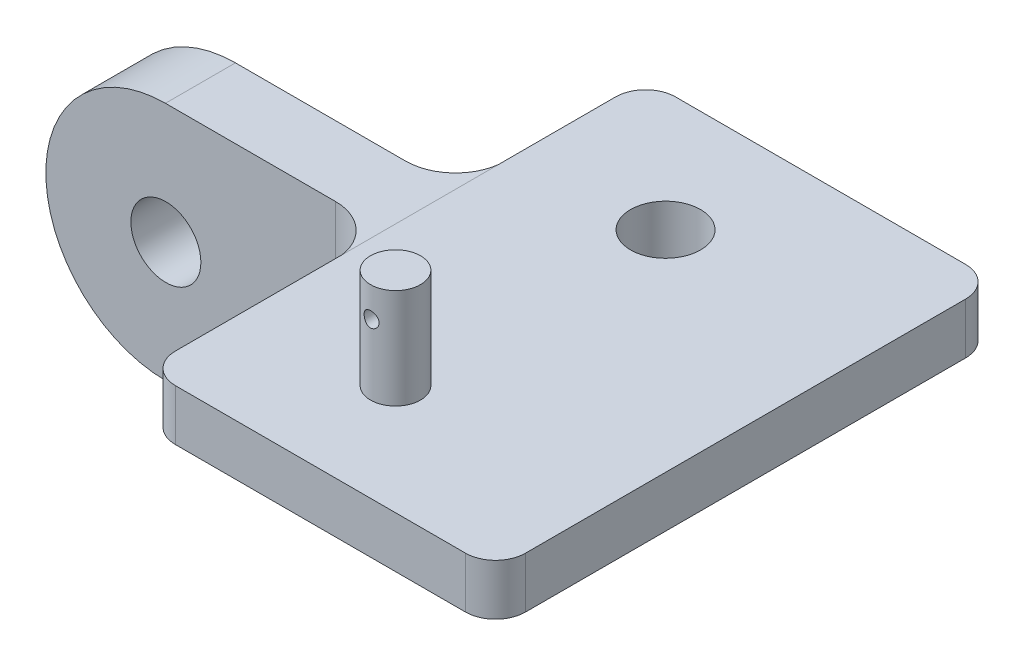
ISO-10303-21;
HEADER;
FILE_DESCRIPTION(('STEP AP214'),'2;1');
FILE_NAME('part.step','',(''),(''),'','','');
FILE_SCHEMA(('AUTOMOTIVE_DESIGN { 1 0 10303 214 1 1 1 1 }'));
ENDSEC;
DATA;
#1=APPLICATION_CONTEXT('core data for automotive mechanical design processes');
#2=APPLICATION_PROTOCOL_DEFINITION('international standard','automotive_design',2000,#1);
#3=PRODUCT_CONTEXT('',#1,'mechanical');
#4=PRODUCT('Part','Part','',(#3));
#5=PRODUCT_RELATED_PRODUCT_CATEGORY('part','',(#4));
#6=PRODUCT_DEFINITION_FORMATION('','',#4);
#7=PRODUCT_DEFINITION_CONTEXT('part definition',#1,'design');
#8=PRODUCT_DEFINITION('design','',#6,#7);
#9=PRODUCT_DEFINITION_SHAPE('','',#8);
#10=(LENGTH_UNIT() NAMED_UNIT(*) SI_UNIT(.MILLI.,.METRE.));
#11=(NAMED_UNIT(*) PLANE_ANGLE_UNIT() SI_UNIT($,.RADIAN.));
#12=(NAMED_UNIT(*) SI_UNIT($,.STERADIAN.) SOLID_ANGLE_UNIT());
#13=UNCERTAINTY_MEASURE_WITH_UNIT(LENGTH_MEASURE(1.E-05),#10,'distance_accuracy_value','');
#14=(GEOMETRIC_REPRESENTATION_CONTEXT(3) GLOBAL_UNCERTAINTY_ASSIGNED_CONTEXT((#13)) GLOBAL_UNIT_ASSIGNED_CONTEXT((#10,
#11,#12)) REPRESENTATION_CONTEXT('',''));
#15=CARTESIAN_POINT('',(0.,0.,0.));
#16=DIRECTION('',(0.,0.,1.));
#17=DIRECTION('',(1.,0.,0.));
#18=AXIS2_PLACEMENT_3D('',#15,#16,#17);
#19=CARTESIAN_POINT('',(-3.13547508911628,13.8103235534472,7.));
#20=DIRECTION('',(0.,0.,1.));
#21=DIRECTION('',(1.,0.,0.));
#22=AXIS2_PLACEMENT_3D('',#19,#20,#21);
#23=PLANE('',#22);
#24=CARTESIAN_POINT('',(-3.13547508911628,13.8103235534472,7.));
#25=DIRECTION('',(0.,0.,1.));
#26=DIRECTION('',(1.,0.,0.));
#27=AXIS2_PLACEMENT_3D('',#24,#25,#26);
#28=CIRCLE('',#27,26.);
#29=CARTESIAN_POINT('',(-1.12751244819405E-06,-11.9999225328672,7.));
#30=VERTEX_POINT('',#29);
#31=CARTESIAN_POINT('',(16.9567446831032,-2.69127347910797,7.));
#32=VERTEX_POINT('',#31);
#33=EDGE_CURVE('E172',#30,#32,#28,.T.);
#34=ORIENTED_EDGE('',*,*,#33,.T.);
#35=DIRECTION('',(0.,1.,0.));
#36=VECTOR('',#35,1.);
#37=CARTESIAN_POINT('',(16.9567446831032,13.8103235534472,7.));
#38=LINE('',#37,#36);
#39=CARTESIAN_POINT('',(16.9567446831032,12.,7.));
#40=VERTEX_POINT('',#39);
#41=EDGE_CURVE('E154',#32,#40,#38,.T.);
#42=ORIENTED_EDGE('',*,*,#41,.T.);
#43=DIRECTION('',(-1.,0.,0.));
#44=VECTOR('',#43,1.);
#45=CARTESIAN_POINT('',(-0.0432553168967856,12.,7.));
#46=LINE('',#45,#44);
#47=CARTESIAN_POINT('',(-0.0432553168967856,12.,7.));
#48=VERTEX_POINT('',#47);
#49=EDGE_CURVE('E146',#40,#48,#46,.T.);
#50=ORIENTED_EDGE('',*,*,#49,.T.);
#51=CARTESIAN_POINT('',(-0.000137029389256534,7.74663632754913E-05,7.));
#52=DIRECTION('',(0.,0.,1.));
#53=DIRECTION('',(1.,0.,0.));
#54=AXIS2_PLACEMENT_3D('',#51,#52,#53);
#55=CIRCLE('',#54,12.);
#56=EDGE_CURVE('E151',#48,#30,#55,.T.);
#57=ORIENTED_EDGE('',*,*,#56,.T.);
#58=EDGE_LOOP('',(#34,#42,#50,#57));
#59=FACE_BOUND('',#58,.T.);
#60=CARTESIAN_POINT('',(-0.000137029389256534,7.74663632754913E-05,7.));
#61=DIRECTION('',(0.,0.,1.));
#62=DIRECTION('',(1.,0.,0.));
#63=AXIS2_PLACEMENT_3D('',#60,#61,#62);
#64=CIRCLE('',#63,3.5);
#65=CARTESIAN_POINT('',(3.49986297061074,7.74663632754913E-05,7.));
#66=VERTEX_POINT('',#65);
#67=EDGE_CURVE('E180',#66,#66,#64,.T.);
#68=ORIENTED_EDGE('',*,*,#67,.F.);
#69=EDGE_LOOP('',(#68));
#70=FACE_BOUND('',#69,.T.);
#71=ADVANCED_FACE('F36',(#59,#70),#23,.T.);
#72=CARTESIAN_POINT('',(-3.13547508911628,13.8103235534472,0.));
#73=DIRECTION('',(0.,0.,1.));
#74=DIRECTION('',(1.,0.,0.));
#75=AXIS2_PLACEMENT_3D('',#72,#73,#74);
#76=PLANE('',#75);
#77=DIRECTION('',(-1.,0.,0.));
#78=VECTOR('',#77,1.);
#79=CARTESIAN_POINT('',(-0.0432553168967856,12.,0.));
#80=LINE('',#79,#78);
#81=CARTESIAN_POINT('',(16.9567446831032,12.,0.));
#82=VERTEX_POINT('',#81);
#83=CARTESIAN_POINT('',(-0.0432553168967856,12.,0.));
#84=VERTEX_POINT('',#83);
#85=EDGE_CURVE('E163',#82,#84,#80,.T.);
#86=ORIENTED_EDGE('',*,*,#85,.F.);
#87=DIRECTION('',(0.,1.,0.));
#88=VECTOR('',#87,1.);
#89=CARTESIAN_POINT('',(16.9567446831032,6.99999999999999,0.));
#90=LINE('',#89,#88);
#91=CARTESIAN_POINT('',(16.9567446831032,-2.69127347910797,0.));
#92=VERTEX_POINT('',#91);
#93=EDGE_CURVE('E190',#82,#92,#90,.F.);
#94=ORIENTED_EDGE('',*,*,#93,.T.);
#95=CARTESIAN_POINT('',(-3.13547508911628,13.8103235534472,0.));
#96=DIRECTION('',(0.,0.,1.));
#97=DIRECTION('',(1.,0.,0.));
#98=AXIS2_PLACEMENT_3D('',#95,#96,#97);
#99=CIRCLE('',#98,26.);
#100=CARTESIAN_POINT('',(-1.12751244819405E-06,-11.9999225328672,0.));
#101=VERTEX_POINT('',#100);
#102=EDGE_CURVE('E157',#101,#92,#99,.T.);
#103=ORIENTED_EDGE('',*,*,#102,.F.);
#104=CARTESIAN_POINT('',(-0.000137029389256534,7.74663632754913E-05,0.));
#105=DIRECTION('',(0.,0.,1.));
#106=DIRECTION('',(1.,0.,0.));
#107=AXIS2_PLACEMENT_3D('',#104,#105,#106);
#108=CIRCLE('',#107,12.);
#109=EDGE_CURVE('E179',#84,#101,#108,.T.);
#110=ORIENTED_EDGE('',*,*,#109,.F.);
#111=EDGE_LOOP('',(#86,#94,#103,#110));
#112=FACE_BOUND('',#111,.T.);
#113=CARTESIAN_POINT('',(-0.000137029389256534,7.74663632754913E-05,0.));
#114=DIRECTION('',(0.,0.,1.));
#115=DIRECTION('',(1.,0.,0.));
#116=AXIS2_PLACEMENT_3D('',#113,#114,#115);
#117=CIRCLE('',#116,3.5);
#118=CARTESIAN_POINT('',(3.49986297061074,7.74663632754913E-05,0.));
#119=VERTEX_POINT('',#118);
#120=EDGE_CURVE('E357',#119,#119,#117,.T.);
#121=ORIENTED_EDGE('',*,*,#120,.T.);
#122=EDGE_LOOP('',(#121));
#123=FACE_BOUND('',#122,.T.);
#124=ADVANCED_FACE('F292',(#112,#123),#76,.F.);
#125=CARTESIAN_POINT('',(-0.0432553168967856,12.,7.));
#126=DIRECTION('',(0.,-1.,0.));
#127=DIRECTION('',(0.,0.,-1.));
#128=AXIS2_PLACEMENT_3D('',#125,#126,#127);
#129=PLANE('',#128);
#130=DIRECTION('',(0.,0.,-1.));
#131=VECTOR('',#130,1.);
#132=CARTESIAN_POINT('',(21.9567446831032,12.,7.));
#133=LINE('',#132,#131);
#134=CARTESIAN_POINT('',(21.9567446831032,12.,12.));
#135=VERTEX_POINT('',#134);
#136=CARTESIAN_POINT('',(21.9567446831032,12.,-5.));
#137=VERTEX_POINT('',#136);
#138=EDGE_CURVE('E166',#135,#137,#133,.T.);
#139=ORIENTED_EDGE('',*,*,#138,.T.);
#140=CARTESIAN_POINT('',(16.9567446831032,12.,-5.));
#141=DIRECTION('',(0.,-1.,0.));
#142=DIRECTION('',(0.,0.,-1.));
#143=AXIS2_PLACEMENT_3D('',#140,#141,#142);
#144=CIRCLE('',#143,5.);
#145=EDGE_CURVE('E192',#137,#82,#144,.T.);
#146=ORIENTED_EDGE('',*,*,#145,.T.);
#147=ORIENTED_EDGE('',*,*,#85,.T.);
#148=DIRECTION('',(0.,0.,-1.));
#149=VECTOR('',#148,1.);
#150=CARTESIAN_POINT('',(-0.0432553168967856,12.,7.));
#151=LINE('',#150,#149);
#152=EDGE_CURVE('E160',#48,#84,#151,.T.);
#153=ORIENTED_EDGE('',*,*,#152,.F.);
#154=ORIENTED_EDGE('',*,*,#49,.F.);
#155=CARTESIAN_POINT('',(16.9567446831032,12.,12.));
#156=DIRECTION('',(0.,-1.,0.));
#157=DIRECTION('',(0.,0.,-1.));
#158=AXIS2_PLACEMENT_3D('',#155,#156,#157);
#159=CIRCLE('',#158,5.);
#160=EDGE_CURVE('E232',#40,#135,#159,.T.);
#161=ORIENTED_EDGE('',*,*,#160,.T.);
#162=EDGE_LOOP('',(#139,#146,#147,#153,#154,#161));
#163=FACE_BOUND('',#162,.T.);
#164=ADVANCED_FACE('F161',(#163),#129,.F.);
#165=CARTESIAN_POINT('',(-0.000137029389256534,7.74663632754913E-05,7.));
#166=DIRECTION('',(0.,0.,-1.));
#167=DIRECTION('',(-1.,0.,0.));
#168=AXIS2_PLACEMENT_3D('',#165,#166,#167);
#169=CYLINDRICAL_SURFACE('',#168,12.);
#170=ORIENTED_EDGE('',*,*,#109,.T.);
#171=DIRECTION('',(0.,0.,-1.));
#172=VECTOR('',#171,1.);
#173=CARTESIAN_POINT('',(-1.12751244819405E-06,-11.9999225328672,7.));
#174=LINE('',#173,#172);
#175=EDGE_CURVE('E167',#30,#101,#174,.T.);
#176=ORIENTED_EDGE('',*,*,#175,.F.);
#177=ORIENTED_EDGE('',*,*,#56,.F.);
#178=ORIENTED_EDGE('',*,*,#152,.T.);
#179=EDGE_LOOP('',(#170,#176,#177,#178));
#180=FACE_BOUND('',#179,.T.);
#181=ADVANCED_FACE('F169',(#180),#169,.T.);
#182=CARTESIAN_POINT('',(-3.13547508911628,13.8103235534472,7.));
#183=DIRECTION('',(0.,0.,-1.));
#184=DIRECTION('',(-1.,0.,0.));
#185=AXIS2_PLACEMENT_3D('',#182,#183,#184);
#186=CYLINDRICAL_SURFACE('',#185,26.);
#187=ORIENTED_EDGE('',*,*,#102,.T.);
#188=CARTESIAN_POINT('',(16.9567446831032,-2.69127347910797,0.));
#189=CARTESIAN_POINT('',(17.070231099464,-2.5530994384239,-9.26989505541306E-06));
#190=CARTESIAN_POINT('',(17.1822707251696,-2.41376868599156,-0.00386335790764295));
#191=CARTESIAN_POINT('',(17.4032466272942,-2.13309982371133,-0.018743276288638));
#192=CARTESIAN_POINT('',(17.5121837152668,-1.99176225356995,-0.0297672128644955));
#193=CARTESIAN_POINT('',(17.7266646073226,-1.70749850083177,-0.0584507238668967));
#194=CARTESIAN_POINT('',(17.8322126611707,-1.56457463651689,-0.0761016048940113));
#195=CARTESIAN_POINT('',(18.0399453478979,-1.27718840935005,-0.117593425972296));
#196=CARTESIAN_POINT('',(18.1421297314987,-1.13272593351839,-0.141434823638278));
#197=CARTESIAN_POINT('',(18.4440397339031,-0.696562483241409,-0.221774757620746));
#198=CARTESIAN_POINT('',(18.6385665045677,-0.402822755666844,-0.287010620158538));
#199=CARTESIAN_POINT('',(19.013315052953,0.18851248198175,-0.438054133036577));
#200=CARTESIAN_POINT('',(19.1935316149241,0.486109352344615,-0.523869238652336));
#201=CARTESIAN_POINT('',(19.5512288599767,1.10404903438962,-0.720618176466617));
#202=CARTESIAN_POINT('',(19.7276910324922,1.42456303540939,-0.83286285302044));
#203=CARTESIAN_POINT('',(20.0640967127785,2.06676217933068,-1.07729115280325));
#204=CARTESIAN_POINT('',(20.2240368581029,2.38844754688423,-1.20947882127396));
#205=CARTESIAN_POINT('',(20.4513137732606,2.86981070832899,-1.42247251980998));
#206=CARTESIAN_POINT('',(20.5248909699477,3.0298902668681,-1.49583105647801));
#207=CARTESIAN_POINT('',(20.6679082258822,3.34946461568907,-1.64766484852491));
#208=CARTESIAN_POINT('',(20.737348620187,3.50895945234537,-1.72613968843145));
#209=CARTESIAN_POINT('',(20.8720280963283,3.82685843517659,-1.88846150692929));
#210=CARTESIAN_POINT('',(20.9372695201537,3.98526314455929,-1.97230543790661));
#211=CARTESIAN_POINT('',(21.0635290544233,4.30048617735711,-2.14590658770641));
#212=CARTESIAN_POINT('',(21.1245478931708,4.45730477033854,-2.23566278155448));
#213=CARTESIAN_POINT('',(21.2174878868822,4.70304725180356,-2.38272397252399));
#214=CARTESIAN_POINT('',(21.2508473473785,4.79276939958791,-2.43778868012347));
#215=CARTESIAN_POINT('',(21.3160758164162,4.97116671594358,-2.55041687915507));
#216=CARTESIAN_POINT('',(21.3479448878814,5.05984192859791,-2.60798026489529));
#217=CARTESIAN_POINT('',(21.4413528905842,5.32419565360777,-2.7850050545784));
#218=CARTESIAN_POINT('',(21.5006022395724,5.49796256636809,-2.90865984037733));
#219=CARTESIAN_POINT('',(21.584539599234,5.75247093173351,-3.10563388944553));
#220=CARTESIAN_POINT('',(21.611792920174,5.83660086591316,-3.17349604971766));
#221=CARTESIAN_POINT('',(21.6643801124058,6.00169592304559,-3.31364833583479));
#222=CARTESIAN_POINT('',(21.6897146579761,6.08266215287109,-3.38593688989556));
#223=CARTESIAN_POINT('',(21.7381858659548,6.24013416058078,-3.53575508028062));
#224=CARTESIAN_POINT('',(21.7613252489371,6.31664541306305,-3.61327801977087));
#225=CARTESIAN_POINT('',(21.8050075556827,6.46334049119167,-3.77470866779921));
#226=CARTESIAN_POINT('',(21.8255535191316,6.53353169621413,-3.85860871348025));
#227=CARTESIAN_POINT('',(21.8613334169811,6.65747352106164,-4.02460174826745));
#228=CARTESIAN_POINT('',(21.8769023449687,6.71218234418246,-4.10589312313181));
#229=CARTESIAN_POINT('',(21.9046295722402,6.81062676490551,-4.27492916479743));
#230=CARTESIAN_POINT('',(21.9168073492532,6.85442487038787,-4.36263316396412));
#231=CARTESIAN_POINT('',(21.9362302461275,6.92476816378259,-4.5394518766194));
#232=CARTESIAN_POINT('',(21.9437244131123,6.95218023411873,-4.62817667526831));
#233=CARTESIAN_POINT('',(21.9514299362848,6.98044115703928,-4.76491959780763));
#234=CARTESIAN_POINT('',(21.9534104638482,6.98772407873483,-4.81154257636176));
#235=CARTESIAN_POINT('',(21.956072837743,6.99752439723626,-4.90542857855493));
#236=CARTESIAN_POINT('',(21.9567516672798,7.00003072379892,-4.95269283394889));
#237=CARTESIAN_POINT('',(21.9567446831032,6.99999999999998,-5.00000000000001));
#238=B_SPLINE_CURVE_WITH_KNOTS('',3,(#188,#189,#190,#191,#192,#193,#194,#195,#196,#197,#198,
#199,#200,#201,#202,#203,#204,#205,#206,#207,#208,#209,#210,#211,#212,#213,#214,#215,#216,#217,
#218,#219,#220,#221,#222,#223,#224,#225,#226,#227,#228,#229,#230,#231,#232,#233,#234,#235,#236,
#237),.UNSPECIFIED.,.F.,.F.,(4,2,2,2,2,2,2,2,2,2,2,2,2,2,2,2,2,2,2,2,2,2,2,2,4),(0.,
0.536328347004376,1.07251508957235,1.60800089212395,2.14352629008362,3.21734907871913,
4.29156147210523,5.43878676512284,6.58624507526594,7.15867879259614,7.73106608287921,
8.30313130509501,8.87509761141322,9.20634881475193,9.53758602008221,10.2009369110301,
10.5352431417181,10.8694313431759,11.2031998044433,11.536573357518,11.8335734757139,
12.128830774077,12.406633146776,12.5480808917549,12.6898560594473),.UNSPECIFIED.);
#239=CARTESIAN_POINT('',(21.9567446831032,6.99999999999999,-5.));
#240=VERTEX_POINT('',#239);
#241=EDGE_CURVE('E194',#92,#240,#238,.T.);
#242=ORIENTED_EDGE('',*,*,#241,.T.);
#243=DIRECTION('',(0.,0.,-1.));
#244=VECTOR('',#243,1.);
#245=CARTESIAN_POINT('',(21.9567446831032,6.99999999999999,7.));
#246=LINE('',#245,#244);
#247=CARTESIAN_POINT('',(21.9567446831032,6.99999999999999,12.));
#248=VERTEX_POINT('',#247);
#249=EDGE_CURVE('E174',#248,#240,#246,.T.);
#250=ORIENTED_EDGE('',*,*,#249,.F.);
#251=CARTESIAN_POINT('',(21.9567446831032,6.99999999999999,12.));
#252=CARTESIAN_POINT('',(21.9567519061623,7.00003157662,11.9524518786257));
#253=CARTESIAN_POINT('',(21.9560659914514,6.99749910440314,11.904945764695));
#254=CARTESIAN_POINT('',(21.9533766072229,6.98759957907609,11.8105914660933));
#255=CARTESIAN_POINT('',(21.9513763755148,6.98024440674368,11.7637419528228));
#256=CARTESIAN_POINT('',(21.9436091984904,6.95175829780433,11.6265859841257));
#257=CARTESIAN_POINT('',(21.936069548161,6.92418080713381,11.5376897560204));
#258=CARTESIAN_POINT('',(21.914229994076,6.84509754447567,11.3395714591159));
#259=CARTESIAN_POINT('',(21.8985659751406,6.78884716756748,11.2324768576382));
#260=CARTESIAN_POINT('',(21.8624149253361,6.66120103811573,11.0277209268175));
#261=CARTESIAN_POINT('',(21.841885225347,6.58967188160368,10.9301545015548));
#262=CARTESIAN_POINT('',(21.791052663107,6.41583120669735,10.7176014140227));
#263=CARTESIAN_POINT('',(21.7596233440989,6.31051120114156,10.6053970655641));
#264=CARTESIAN_POINT('',(21.6923417918251,6.09068476546389,10.3916910317502));
#265=CARTESIAN_POINT('',(21.6564808949337,5.97616049899554,10.2902110539888));
#266=CARTESIAN_POINT('',(21.5809118637296,5.74090273575955,10.0952591574272));
#267=CARTESIAN_POINT('',(21.5411882455394,5.62014524249258,10.0018225578282));
#268=CARTESIAN_POINT('',(21.4584424271534,5.37492330053209,9.82181105622904));
#269=CARTESIAN_POINT('',(21.4154229320645,5.25046194204889,9.73523064320604));
#270=CARTESIAN_POINT('',(21.3105479706788,4.95456212270258,9.53811090353333));
#271=CARTESIAN_POINT('',(21.2474009292567,4.78203878192894,9.42989280827805));
#272=CARTESIAN_POINT('',(21.1156949082844,4.43400107121861,9.22182237660135));
#273=CARTESIAN_POINT('',(21.0471341771556,4.25848574775867,9.12197276949031));
#274=CARTESIAN_POINT('',(20.9046685083122,3.90538602742121,8.92945437716824));
#275=CARTESIAN_POINT('',(20.8307570113938,3.72779932283544,8.83679470399372));
#276=CARTESIAN_POINT('',(20.677728466236,3.37150454308323,8.65812773496286));
#277=CARTESIAN_POINT('',(20.5986107801559,3.19279633294998,8.57212125704709));
#278=CARTESIAN_POINT('',(20.435391562979,2.83522547803328,8.40660428439873));
#279=CARTESIAN_POINT('',(20.3513017742726,2.65636410854854,8.32707946254272));
#280=CARTESIAN_POINT('',(20.1779856718968,2.29849913136255,8.17417292435706));
#281=CARTESIAN_POINT('',(20.0887588869079,2.11949551210056,8.10079177323012));
#282=CARTESIAN_POINT('',(19.8134924145091,1.58304883757136,7.88995549165921));
#283=CARTESIAN_POINT('',(19.6197291177132,1.22586750432766,7.76166822833575));
#284=CARTESIAN_POINT('',(19.24023468021,0.564490433641979,7.54733201672991));
#285=CARTESIAN_POINT('',(19.0571593179198,0.259859705621283,7.45788654624362));
#286=CARTESIAN_POINT('',(18.6759969080601,-0.345504657650246,7.30035252399422));
#287=CARTESIAN_POINT('',(18.4779147959702,-0.646239536407275,7.23225698811428));
#288=CARTESIAN_POINT('',(18.1699681329198,-1.09305960340722,7.14825957622648));
#289=CARTESIAN_POINT('',(18.0655456176492,-1.24124564059011,7.12328914118702));
#290=CARTESIAN_POINT('',(17.8531589036812,-1.53601896259447,7.079817872673));
#291=CARTESIAN_POINT('',(17.7451949867737,-1.68260637338808,7.06131652581144));
#292=CARTESIAN_POINT('',(17.5257063909819,-1.97412763323084,7.03124017802874));
#293=CARTESIAN_POINT('',(17.4141771959051,-2.11905904160829,7.01967436085838));
#294=CARTESIAN_POINT('',(17.1878544463635,-2.40682332416509,7.00405832502508));
#295=CARTESIAN_POINT('',(17.0730599800155,-2.54965559489391,7.00001022715803));
#296=CARTESIAN_POINT('',(16.9567446831032,-2.69127347910797,6.99999999999999));
#297=B_SPLINE_CURVE_WITH_KNOTS('',3,(#251,#252,#253,#254,#255,#256,#257,#258,#259,#260,#261,
#262,#263,#264,#265,#266,#267,#268,#269,#270,#271,#272,#273,#274,#275,#276,#277,#278,#279,#280,
#281,#282,#283,#284,#285,#286,#287,#288,#289,#290,#291,#292,#293,#294,#295,#296),.UNSPECIFIED.,
.F.,.F.,(4,2,2,2,2,2,2,2,2,2,2,2,2,2,2,2,2,2,2,2,2,2,4),(0.,0.142498991729863,0.284648247851413,
0.563115048921898,0.92698264107146,1.29416759067601,1.76427052715708,2.23530749072554,
2.70831723994238,3.18094283958567,3.82027840493175,4.45982167917354,5.10016266052838,
5.7405822403896,6.37954550573665,7.0185674896985,8.29553328546095,9.39420756841612,
10.4925220706461,11.0413766810493,11.5901877244471,12.1397238858821,12.689415051388),.UNSPECIFIED.);
#298=EDGE_CURVE('E224',#248,#32,#297,.T.);
#299=ORIENTED_EDGE('',*,*,#298,.T.);
#300=ORIENTED_EDGE('',*,*,#33,.F.);
#301=ORIENTED_EDGE('',*,*,#175,.T.);
#302=EDGE_LOOP('',(#187,#242,#250,#299,#300,#301));
#303=FACE_BOUND('',#302,.T.);
#304=ADVANCED_FACE('F204',(#303),#186,.T.);
#305=CARTESIAN_POINT('',(-0.000137029389256534,7.74663632754913E-05,7.));
#306=DIRECTION('',(0.,0.,-1.));
#307=DIRECTION('',(-1.,0.,0.));
#308=AXIS2_PLACEMENT_3D('',#305,#306,#307);
#309=CYLINDRICAL_SURFACE('',#308,3.5);
#310=ORIENTED_EDGE('',*,*,#67,.T.);
#311=EDGE_LOOP('',(#310));
#312=FACE_BOUND('',#311,.T.);
#313=ORIENTED_EDGE('',*,*,#120,.F.);
#314=EDGE_LOOP('',(#313));
#315=FACE_BOUND('',#314,.T.);
#316=ADVANCED_FACE('F299',(#312,#315),#309,.F.);
#317=CARTESIAN_POINT('',(21.9567446831032,0.,0.));
#318=DIRECTION('',(1.,0.,0.));
#319=DIRECTION('',(0.,0.,-1.));
#320=AXIS2_PLACEMENT_3D('',#317,#318,#319);
#321=PLANE('',#320);
#322=DIRECTION('',(0.,0.,1.));
#323=VECTOR('',#322,1.);
#324=CARTESIAN_POINT('',(21.9567446831032,12.0511146329245,26.));
#325=LINE('',#324,#323);
#326=CARTESIAN_POINT('',(21.9567446831032,12.0511146329245,-16.));
#327=VERTEX_POINT('',#326);
#328=CARTESIAN_POINT('',(21.9567446831032,12.0511146329245,28.));
#329=VERTEX_POINT('',#328);
#330=EDGE_CURVE('E335',#327,#329,#325,.T.);
#331=ORIENTED_EDGE('',*,*,#330,.F.);
#332=DIRECTION('',(0.,1.,0.));
#333=VECTOR('',#332,1.);
#334=CARTESIAN_POINT('',(21.9567446831032,0.,-16.));
#335=LINE('',#334,#333);
#336=CARTESIAN_POINT('',(21.9567446831032,6.94888536707552,-16.));
#337=VERTEX_POINT('',#336);
#338=EDGE_CURVE('E256',#327,#337,#335,.F.);
#339=ORIENTED_EDGE('',*,*,#338,.T.);
#340=DIRECTION('',(0.,0.,-1.));
#341=VECTOR('',#340,1.);
#342=CARTESIAN_POINT('',(21.9567446831032,6.94888536707552,26.));
#343=LINE('',#342,#341);
#344=CARTESIAN_POINT('',(21.9567446831032,6.94888536707552,28.));
#345=VERTEX_POINT('',#344);
#346=EDGE_CURVE('E345',#345,#337,#343,.T.);
#347=ORIENTED_EDGE('',*,*,#346,.F.);
#348=DIRECTION('',(0.,-1.,0.));
#349=VECTOR('',#348,1.);
#350=CARTESIAN_POINT('',(21.9567446831032,12.0511146329245,28.));
#351=LINE('',#350,#349);
#352=EDGE_CURVE('E254',#345,#329,#351,.F.);
#353=ORIENTED_EDGE('',*,*,#352,.T.);
#354=EDGE_LOOP('',(#331,#339,#347,#353));
#355=FACE_BOUND('',#354,.T.);
#356=ORIENTED_EDGE('',*,*,#138,.F.);
#357=DIRECTION('',(0.,1.,0.));
#358=VECTOR('',#357,1.);
#359=CARTESIAN_POINT('',(21.9567446831032,0.,12.));
#360=LINE('',#359,#358);
#361=EDGE_CURVE('E594',#135,#248,#360,.F.);
#362=ORIENTED_EDGE('',*,*,#361,.T.);
#363=ORIENTED_EDGE('',*,*,#249,.T.);
#364=DIRECTION('',(0.,1.,0.));
#365=VECTOR('',#364,1.);
#366=CARTESIAN_POINT('',(21.9567446831032,12.,-5.));
#367=LINE('',#366,#365);
#368=EDGE_CURVE('E187',#240,#137,#367,.T.);
#369=ORIENTED_EDGE('',*,*,#368,.T.);
#370=EDGE_LOOP('',(#356,#362,#363,#369));
#371=FACE_BOUND('',#370,.T.);
#372=ADVANCED_FACE('F302',(#355,#371),#321,.F.);
#373=CARTESIAN_POINT('',(56.9567446831032,12.0511146329245,-19.));
#374=DIRECTION('',(0.,0.,1.));
#375=DIRECTION('',(1.,0.,0.));
#376=AXIS2_PLACEMENT_3D('',#373,#374,#375);
#377=PLANE('',#376);
#378=DIRECTION('',(-1.,0.,0.));
#379=VECTOR('',#378,1.);
#380=CARTESIAN_POINT('',(56.9567446831032,6.94888536707553,-19.));
#381=LINE('',#380,#379);
#382=CARTESIAN_POINT('',(53.9567446831032,6.94888536707553,-19.));
#383=VERTEX_POINT('',#382);
#384=CARTESIAN_POINT('',(24.9567446831032,6.94888536707552,-19.));
#385=VERTEX_POINT('',#384);
#386=EDGE_CURVE('E347',#383,#385,#381,.T.);
#387=ORIENTED_EDGE('',*,*,#386,.T.);
#388=DIRECTION('',(0.,1.,0.));
#389=VECTOR('',#388,1.);
#390=CARTESIAN_POINT('',(24.9567446831032,12.0511146329245,-19.));
#391=LINE('',#390,#389);
#392=CARTESIAN_POINT('',(24.9567446831032,12.0511146329245,-19.));
#393=VERTEX_POINT('',#392);
#394=EDGE_CURVE('E245',#385,#393,#391,.T.);
#395=ORIENTED_EDGE('',*,*,#394,.T.);
#396=DIRECTION('',(-1.,0.,0.));
#397=VECTOR('',#396,1.);
#398=CARTESIAN_POINT('',(56.9567446831032,12.0511146329245,-19.));
#399=LINE('',#398,#397);
#400=CARTESIAN_POINT('',(53.9567446831032,12.0511146329245,-19.));
#401=VERTEX_POINT('',#400);
#402=EDGE_CURVE('E354',#401,#393,#399,.T.);
#403=ORIENTED_EDGE('',*,*,#402,.F.);
#404=DIRECTION('',(0.,1.,0.));
#405=VECTOR('',#404,1.);
#406=CARTESIAN_POINT('',(53.9567446831032,6.94888536707553,-19.));
#407=LINE('',#406,#405);
#408=EDGE_CURVE('E240',#401,#383,#407,.F.);
#409=ORIENTED_EDGE('',*,*,#408,.T.);
#410=EDGE_LOOP('',(#387,#395,#403,#409));
#411=FACE_BOUND('',#410,.T.);
#412=ADVANCED_FACE('F304',(#411),#377,.F.);
#413=CARTESIAN_POINT('',(56.9567446831032,12.0511146329245,26.));
#414=DIRECTION('',(0.,-1.,0.));
#415=DIRECTION('',(1.,0.,0.));
#416=AXIS2_PLACEMENT_3D('',#413,#414,#415);
#417=PLANE('',#416);
#418=CARTESIAN_POINT('',(35.9567446831032,12.0511146329245,20.));
#419=DIRECTION('',(0.,-1.,0.));
#420=DIRECTION('',(1.,0.,0.));
#421=AXIS2_PLACEMENT_3D('',#418,#419,#420);
#422=CIRCLE('',#421,2.5);
#423=CARTESIAN_POINT('',(38.4567446831032,12.0511146329245,20.));
#424=VERTEX_POINT('',#423);
#425=EDGE_CURVE('E231',#424,#424,#422,.F.);
#426=ORIENTED_EDGE('',*,*,#425,.F.);
#427=EDGE_LOOP('',(#426));
#428=FACE_BOUND('',#427,.T.);
#429=CARTESIAN_POINT('',(35.9567446831032,12.0511146329245,-7.));
#430=DIRECTION('',(0.,1.,0.));
#431=DIRECTION('',(-1.,0.,0.));
#432=AXIS2_PLACEMENT_3D('',#429,#430,#431);
#433=CIRCLE('',#432,3.5);
#434=CARTESIAN_POINT('',(32.4567446831032,12.0511146329245,-7.));
#435=VERTEX_POINT('',#434);
#436=EDGE_CURVE('E331',#435,#435,#433,.T.);
#437=ORIENTED_EDGE('',*,*,#436,.F.);
#438=EDGE_LOOP('',(#437));
#439=FACE_BOUND('',#438,.T.);
#440=ORIENTED_EDGE('',*,*,#402,.T.);
#441=CARTESIAN_POINT('',(24.9567446831032,12.0511146329245,-16.));
#442=DIRECTION('',(0.,-1.,0.));
#443=DIRECTION('',(1.,0.,0.));
#444=AXIS2_PLACEMENT_3D('',#441,#442,#443);
#445=CIRCLE('',#444,3.);
#446=EDGE_CURVE('E252',#393,#327,#445,.F.);
#447=ORIENTED_EDGE('',*,*,#446,.T.);
#448=ORIENTED_EDGE('',*,*,#330,.T.);
#449=CARTESIAN_POINT('',(24.9567446831032,12.0511146329245,28.));
#450=DIRECTION('',(0.,-1.,0.));
#451=DIRECTION('',(1.,0.,0.));
#452=AXIS2_PLACEMENT_3D('',#449,#450,#451);
#453=CIRCLE('',#452,3.);
#454=CARTESIAN_POINT('',(24.9567446831032,12.0511146329245,31.));
#455=VERTEX_POINT('',#454);
#456=EDGE_CURVE('E250',#329,#455,#453,.F.);
#457=ORIENTED_EDGE('',*,*,#456,.T.);
#458=DIRECTION('',(-1.,0.,0.));
#459=VECTOR('',#458,1.);
#460=CARTESIAN_POINT('',(21.9567446831032,12.0511146329245,31.));
#461=LINE('',#460,#459);
#462=CARTESIAN_POINT('',(53.9567446831032,12.0511146329245,31.));
#463=VERTEX_POINT('',#462);
#464=EDGE_CURVE('E337',#463,#455,#461,.T.);
#465=ORIENTED_EDGE('',*,*,#464,.F.);
#466=CARTESIAN_POINT('',(53.9567446831032,12.0511146329245,28.));
#467=DIRECTION('',(0.,-1.,0.));
#468=DIRECTION('',(1.,0.,0.));
#469=AXIS2_PLACEMENT_3D('',#466,#467,#468);
#470=CIRCLE('',#469,3.);
#471=CARTESIAN_POINT('',(56.9567446831032,12.0511146329245,28.));
#472=VERTEX_POINT('',#471);
#473=EDGE_CURVE('E248',#463,#472,#470,.F.);
#474=ORIENTED_EDGE('',*,*,#473,.T.);
#475=DIRECTION('',(0.,0.,1.));
#476=VECTOR('',#475,1.);
#477=CARTESIAN_POINT('',(56.9567446831032,12.0511146329245,26.));
#478=LINE('',#477,#476);
#479=CARTESIAN_POINT('',(56.9567446831032,12.0511146329245,-16.));
#480=VERTEX_POINT('',#479);
#481=EDGE_CURVE('E341',#480,#472,#478,.T.);
#482=ORIENTED_EDGE('',*,*,#481,.F.);
#483=CARTESIAN_POINT('',(53.9567446831032,12.0511146329245,-16.));
#484=DIRECTION('',(0.,-1.,0.));
#485=DIRECTION('',(1.,0.,0.));
#486=AXIS2_PLACEMENT_3D('',#483,#484,#485);
#487=CIRCLE('',#486,3.);
#488=EDGE_CURVE('E238',#480,#401,#487,.F.);
#489=ORIENTED_EDGE('',*,*,#488,.T.);
#490=EDGE_LOOP('',(#440,#447,#448,#457,#465,#474,#482,#489));
#491=FACE_BOUND('',#490,.T.);
#492=ADVANCED_FACE('F307',(#428,#439,#491),#417,.F.);
#493=CARTESIAN_POINT('',(56.9567446831032,6.94888536707553,26.));
#494=DIRECTION('',(0.,1.,0.));
#495=DIRECTION('',(-1.,0.,0.));
#496=AXIS2_PLACEMENT_3D('',#493,#494,#495);
#497=PLANE('',#496);
#498=CARTESIAN_POINT('',(35.9567446831032,6.94888536707552,-7.));
#499=DIRECTION('',(0.,1.,0.));
#500=DIRECTION('',(-1.,0.,0.));
#501=AXIS2_PLACEMENT_3D('',#498,#499,#500);
#502=CIRCLE('',#501,3.5);
#503=CARTESIAN_POINT('',(32.4567446831032,6.94888536707552,-7.));
#504=VERTEX_POINT('',#503);
#505=EDGE_CURVE('E328',#504,#504,#502,.F.);
#506=ORIENTED_EDGE('',*,*,#505,.F.);
#507=EDGE_LOOP('',(#506));
#508=FACE_BOUND('',#507,.T.);
#509=ORIENTED_EDGE('',*,*,#346,.T.);
#510=CARTESIAN_POINT('',(24.9567446831032,6.94888536707552,-16.));
#511=DIRECTION('',(0.,1.,0.));
#512=DIRECTION('',(-1.,0.,0.));
#513=AXIS2_PLACEMENT_3D('',#510,#511,#512);
#514=CIRCLE('',#513,3.);
#515=EDGE_CURVE('E260',#337,#385,#514,.F.);
#516=ORIENTED_EDGE('',*,*,#515,.T.);
#517=ORIENTED_EDGE('',*,*,#386,.F.);
#518=CARTESIAN_POINT('',(53.9567446831032,6.94888536707553,-16.));
#519=DIRECTION('',(0.,1.,0.));
#520=DIRECTION('',(-1.,0.,0.));
#521=AXIS2_PLACEMENT_3D('',#518,#519,#520);
#522=CIRCLE('',#521,3.);
#523=CARTESIAN_POINT('',(56.9567446831032,6.94888536707553,-16.));
#524=VERTEX_POINT('',#523);
#525=EDGE_CURVE('E242',#383,#524,#522,.F.);
#526=ORIENTED_EDGE('',*,*,#525,.T.);
#527=DIRECTION('',(0.,0.,-1.));
#528=VECTOR('',#527,1.);
#529=CARTESIAN_POINT('',(56.9567446831032,6.94888536707553,26.));
#530=LINE('',#529,#528);
#531=CARTESIAN_POINT('',(56.9567446831032,6.94888536707553,28.));
#532=VERTEX_POINT('',#531);
#533=EDGE_CURVE('E344',#532,#524,#530,.T.);
#534=ORIENTED_EDGE('',*,*,#533,.F.);
#535=CARTESIAN_POINT('',(53.9567446831032,6.94888536707553,28.));
#536=DIRECTION('',(0.,1.,0.));
#537=DIRECTION('',(-1.,0.,0.));
#538=AXIS2_PLACEMENT_3D('',#535,#536,#537);
#539=CIRCLE('',#538,3.);
#540=CARTESIAN_POINT('',(53.9567446831032,6.94888536707553,31.));
#541=VERTEX_POINT('',#540);
#542=EDGE_CURVE('E58',#532,#541,#539,.F.);
#543=ORIENTED_EDGE('',*,*,#542,.T.);
#544=DIRECTION('',(1.,0.,0.));
#545=VECTOR('',#544,1.);
#546=CARTESIAN_POINT('',(21.9567446831032,6.94888536707553,31.));
#547=LINE('',#546,#545);
#548=CARTESIAN_POINT('',(24.9567446831032,6.94888536707553,31.));
#549=VERTEX_POINT('',#548);
#550=EDGE_CURVE('E380',#549,#541,#547,.T.);
#551=ORIENTED_EDGE('',*,*,#550,.F.);
#552=CARTESIAN_POINT('',(24.9567446831032,6.94888536707552,28.));
#553=DIRECTION('',(0.,1.,0.));
#554=DIRECTION('',(-1.,0.,0.));
#555=AXIS2_PLACEMENT_3D('',#552,#553,#554);
#556=CIRCLE('',#555,3.);
#557=EDGE_CURVE('E66',#549,#345,#556,.F.);
#558=ORIENTED_EDGE('',*,*,#557,.T.);
#559=EDGE_LOOP('',(#509,#516,#517,#526,#534,#543,#551,#558));
#560=FACE_BOUND('',#559,.T.);
#561=ADVANCED_FACE('F311',(#508,#560),#497,.F.);
#562=CARTESIAN_POINT('',(56.9567446831032,0.,0.));
#563=DIRECTION('',(1.,0.,0.));
#564=DIRECTION('',(0.,0.,-1.));
#565=AXIS2_PLACEMENT_3D('',#562,#563,#564);
#566=PLANE('',#565);
#567=ORIENTED_EDGE('',*,*,#481,.T.);
#568=DIRECTION('',(0.,1.,0.));
#569=VECTOR('',#568,1.);
#570=CARTESIAN_POINT('',(56.9567446831032,0.,28.));
#571=LINE('',#570,#569);
#572=EDGE_CURVE('E11',#472,#532,#571,.F.);
#573=ORIENTED_EDGE('',*,*,#572,.T.);
#574=ORIENTED_EDGE('',*,*,#533,.T.);
#575=DIRECTION('',(0.,1.,0.));
#576=VECTOR('',#575,1.);
#577=CARTESIAN_POINT('',(56.9567446831032,12.0511146329245,-16.));
#578=LINE('',#577,#576);
#579=EDGE_CURVE('E235',#524,#480,#578,.T.);
#580=ORIENTED_EDGE('',*,*,#579,.T.);
#581=EDGE_LOOP('',(#567,#573,#574,#580));
#582=FACE_BOUND('',#581,.T.);
#583=ADVANCED_FACE('F214',(#582),#566,.T.);
#584=CARTESIAN_POINT('',(16.9567446831032,0.,-5.));
#585=DIRECTION('',(0.,-1.,0.));
#586=DIRECTION('',(0.,0.,-1.));
#587=AXIS2_PLACEMENT_3D('',#584,#585,#586);
#588=CYLINDRICAL_SURFACE('',#587,5.);
#589=ORIENTED_EDGE('',*,*,#241,.F.);
#590=ORIENTED_EDGE('',*,*,#93,.F.);
#591=ORIENTED_EDGE('',*,*,#145,.F.);
#592=ORIENTED_EDGE('',*,*,#368,.F.);
#593=EDGE_LOOP('',(#589,#590,#591,#592));
#594=FACE_BOUND('',#593,.T.);
#595=ADVANCED_FACE('F208',(#594),#588,.F.);
#596=CARTESIAN_POINT('',(16.9567446831032,13.8103235534472,12.));
#597=DIRECTION('',(0.,1.,0.));
#598=DIRECTION('',(0.,0.,1.));
#599=AXIS2_PLACEMENT_3D('',#596,#597,#598);
#600=CYLINDRICAL_SURFACE('',#599,5.);
#601=ORIENTED_EDGE('',*,*,#298,.F.);
#602=ORIENTED_EDGE('',*,*,#361,.F.);
#603=ORIENTED_EDGE('',*,*,#160,.F.);
#604=ORIENTED_EDGE('',*,*,#41,.F.);
#605=EDGE_LOOP('',(#601,#602,#603,#604));
#606=FACE_BOUND('',#605,.T.);
#607=ADVANCED_FACE('F213',(#606),#600,.F.);
#608=CARTESIAN_POINT('',(35.9567446831032,-2.95060956953615,-7.));
#609=DIRECTION('',(0.,1.,0.));
#610=DIRECTION('',(-1.,0.,0.));
#611=AXIS2_PLACEMENT_3D('',#608,#609,#610);
#612=CYLINDRICAL_SURFACE('',#611,3.5);
#613=ORIENTED_EDGE('',*,*,#505,.T.);
#614=EDGE_LOOP('',(#613));
#615=FACE_BOUND('',#614,.T.);
#616=ORIENTED_EDGE('',*,*,#436,.T.);
#617=EDGE_LOOP('',(#616));
#618=FACE_BOUND('',#617,.T.);
#619=ADVANCED_FACE('F219',(#615,#618),#612,.F.);
#620=CARTESIAN_POINT('',(35.9567446831032,22.0511146329245,20.));
#621=DIRECTION('',(0.,-1.,0.));
#622=DIRECTION('',(1.,0.,0.));
#623=AXIS2_PLACEMENT_3D('',#620,#621,#622);
#624=CYLINDRICAL_SURFACE('',#623,2.5);
#625=CARTESIAN_POINT('',(36.7067446831032,19.0511146329245,17.6151519964576));
#626=CARTESIAN_POINT('',(36.7067441712742,19.0922119068832,17.6151515711767));
#627=CARTESIAN_POINT('',(36.7033552239483,19.1333142449594,17.6140780482293));
#628=CARTESIAN_POINT('',(36.6899239053459,19.2143172576862,17.6099171077564));
#629=CARTESIAN_POINT('',(36.6798793109724,19.2542175261684,17.6068290173371));
#630=CARTESIAN_POINT('',(36.6535084494499,19.3316319970724,17.5990194877665));
#631=CARTESIAN_POINT('',(36.6371926300736,19.3691500477443,17.5943007665361));
#632=CARTESIAN_POINT('',(36.5987767926937,19.4409255999189,17.5837653372099));
#633=CARTESIAN_POINT('',(36.5766759087887,19.4751826122658,17.5779484647807));
#634=CARTESIAN_POINT('',(36.5265684538111,19.5405478282141,17.5656656890858));
#635=CARTESIAN_POINT('',(36.4984107189822,19.5715375818979,17.5591859584457));
#636=CARTESIAN_POINT('',(36.4373128018931,19.6284336085855,17.5464256903123));
#637=CARTESIAN_POINT('',(36.4043720058338,19.6543392281494,17.5401451785104));
#638=CARTESIAN_POINT('',(36.333800402,19.7008459828412,17.5283339271041));
#639=CARTESIAN_POINT('',(36.2960866937711,19.7213263451459,17.5228213782883));
#640=CARTESIAN_POINT('',(36.2175570057879,19.7556082624458,17.5133278203963));
#641=CARTESIAN_POINT('',(36.1767416972972,19.7694112578532,17.5093464810524));
#642=CARTESIAN_POINT('',(36.0944066094186,19.7895546334697,17.5034617699821));
#643=CARTESIAN_POINT('',(36.0529403825801,19.7960971967508,17.5015022131533));
#644=CARTESIAN_POINT('',(35.9694555949779,19.8021732952477,17.4996839924932));
#645=CARTESIAN_POINT('',(35.927437152078,19.8017083026255,17.4998248873946));
#646=CARTESIAN_POINT('',(35.8454591048031,19.793918198653,17.5021519809117));
#647=CARTESIAN_POINT('',(35.8054765492825,19.7868120360195,17.5042728989737));
#648=CARTESIAN_POINT('',(35.7273000763819,19.7662989649273,17.510242389437));
#649=CARTESIAN_POINT('',(35.6891062724418,19.7528916574531,17.5140910712471));
#650=CARTESIAN_POINT('',(35.6150710199276,19.7200086212152,17.5231738950651));
#651=CARTESIAN_POINT('',(35.579262150756,19.7004640315208,17.5284236516162));
#652=CARTESIAN_POINT('',(35.5113623462116,19.6559157067104,17.5397517967599));
#653=CARTESIAN_POINT('',(35.4792722956671,19.6309106764427,17.545830381812));
#654=CARTESIAN_POINT('',(35.4184144423383,19.5750157575487,17.5584422475583));
#655=CARTESIAN_POINT('',(35.3898223929026,19.5439361734096,17.5649840233892));
#656=CARTESIAN_POINT('',(35.3382064254041,19.4773596239795,17.577580100566));
#657=CARTESIAN_POINT('',(35.315183060689,19.44186222023,17.5836343534278));
#658=CARTESIAN_POINT('',(35.2751747064259,19.3669948982999,17.5946104839985));
#659=CARTESIAN_POINT('',(35.2582497369147,19.3275911099925,17.5995209464712));
#660=CARTESIAN_POINT('',(35.2313278687112,19.2463110287022,17.6075180373068));
#661=CARTESIAN_POINT('',(35.2213287099006,19.204435547159,17.6106052606036));
#662=CARTESIAN_POINT('',(35.208870831693,19.1210734525586,17.6144757521176));
#663=CARTESIAN_POINT('',(35.206144951202,19.0796305209824,17.6153406060022));
#664=CARTESIAN_POINT('',(35.2075649469378,18.9968781829216,17.6148940371479));
#665=CARTESIAN_POINT('',(35.2117098612472,18.9555687585571,17.6135829190468));
#666=CARTESIAN_POINT('',(35.2265158652326,18.8753704439357,17.609012207391));
#667=CARTESIAN_POINT('',(35.2370048759469,18.8364465507918,17.605804117507));
#668=CARTESIAN_POINT('',(35.2640017943634,18.7609137875179,17.5978542937995));
#669=CARTESIAN_POINT('',(35.2805106313894,18.7243052758544,17.5931123231926));
#670=CARTESIAN_POINT('',(35.3195853271207,18.6533559008882,17.5824708248971));
#671=CARTESIAN_POINT('',(35.3423018622396,18.6191022724315,17.5765436446543));
#672=CARTESIAN_POINT('',(35.3929681751013,18.5547955798341,17.5642589717617));
#673=CARTESIAN_POINT('',(35.4209192054287,18.5247435241181,17.5579013763491));
#674=CARTESIAN_POINT('',(35.4825171168564,18.4685244300171,17.5451818322601));
#675=CARTESIAN_POINT('',(35.5163391501745,18.442546818431,17.5388287746852));
#676=CARTESIAN_POINT('',(35.5880137908081,18.3966312824106,17.5270757412565));
#677=CARTESIAN_POINT('',(35.6258661978312,18.3766930580338,17.5216757180763));
#678=CARTESIAN_POINT('',(35.7042769307506,18.3436146176403,17.5124701476253));
#679=CARTESIAN_POINT('',(35.7448123720843,18.330423624845,17.5086527328752));
#680=CARTESIAN_POINT('',(35.8276596998509,18.3110841734793,17.5029901020158));
#681=CARTESIAN_POINT('',(35.8699710744258,18.3049336999503,17.5011443216456));
#682=CARTESIAN_POINT('',(35.9534186061618,18.3000031108972,17.499667279593));
#683=CARTESIAN_POINT('',(35.9945372726463,18.3009482852206,17.4999534744434));
#684=CARTESIAN_POINT('',(36.0760044236854,18.309525449174,17.5025136776748));
#685=CARTESIAN_POINT('',(36.1163529517765,18.3171570596647,17.5047875733477));
#686=CARTESIAN_POINT('',(36.1947125896239,18.3387204636243,17.5110441582084));
#687=CARTESIAN_POINT('',(36.2327441467789,18.352583723249,17.5150082354957));
#688=CARTESIAN_POINT('',(36.3059613019792,18.3861555901781,17.5242352848028));
#689=CARTESIAN_POINT('',(36.3411464311285,18.4058651580676,17.5294984702503));
#690=CARTESIAN_POINT('',(36.4088956293135,18.4513013616395,17.5409801708588));
#691=CARTESIAN_POINT('',(36.4413398081416,18.4772003479249,17.5472238653819));
#692=CARTESIAN_POINT('',(36.5015134687762,18.5339698270909,17.5598823139386));
#693=CARTESIAN_POINT('',(36.5292415879042,18.5648417518736,17.5662971167956));
#694=CARTESIAN_POINT('',(36.580026030076,18.6317850220797,17.5787965968423));
#695=CARTESIAN_POINT('',(36.602918481893,18.6679839096196,17.5848657365286));
#696=CARTESIAN_POINT('',(36.642266250747,18.7438922200051,17.59573726246));
#697=CARTESIAN_POINT('',(36.6587246608895,18.7835999447256,17.6005402570302));
#698=CARTESIAN_POINT('',(36.6832543957681,18.8609848487272,17.6078609163987));
#699=CARTESIAN_POINT('',(36.6920389781599,18.8984189563883,17.61056922575));
#700=CARTESIAN_POINT('',(36.7037837772784,18.974272244174,17.6142147870615));
#701=CARTESIAN_POINT('',(36.7067451616317,19.0126912252532,17.615152394069));
#702=CARTESIAN_POINT('',(36.7067446831032,19.0511146329245,17.6151519964576));
#703=B_SPLINE_CURVE_WITH_KNOTS('',3,(#625,#626,#627,#628,#629,#630,#631,#632,#633,#634,#635,
#636,#637,#638,#639,#640,#641,#642,#643,#644,#645,#646,#647,#648,#649,#650,#651,#652,#653,#654,
#655,#656,#657,#658,#659,#660,#661,#662,#663,#664,#665,#666,#667,#668,#669,#670,#671,#672,#673,
#674,#675,#676,#677,#678,#679,#680,#681,#682,#683,#684,#685,#686,#687,#688,#689,#690,#691,#692,
#693,#694,#695,#696,#697,#698,#699,#700,#701,#702),.UNSPECIFIED.,.T.,.F.,(4,2,2,2,2,2,2,2,2,2,2,
2,2,2,2,2,2,2,2,2,2,2,2,2,2,2,2,2,2,2,2,2,2,2,2,2,2,2,4),(0.,0.123150082939933,
0.246341320809978,0.369328207198577,0.492333512650531,0.618865750005396,0.745414239321839,
0.874579696333706,1.00371727790487,1.12916070071327,1.25457777047268,1.37600062991988,
1.49743117941735,1.62027604664385,1.74315008291963,1.87076073508187,1.9983840624248,
2.12723119119681,2.25603625310753,2.38004040390037,2.50402719546923,2.62479297462637,
2.74557740516122,2.86960365897923,2.99365962957691,3.1223975304353,3.25112903655331,
3.37887695900392,3.5065883115407,3.62938151948839,3.75216776517106,3.87363548429338,
3.99512317238918,4.12049813520473,4.24590926308174,4.37505819827802,4.50414496975201,
4.61930576921953,4.73444347510009),.UNSPECIFIED.);
#704=CARTESIAN_POINT('',(36.7067446831032,19.0511146329245,17.6151519964576));
#705=VERTEX_POINT('',#704);
#706=EDGE_CURVE('E40',#705,#705,#703,.T.);
#707=ORIENTED_EDGE('',*,*,#706,.T.);
#708=EDGE_LOOP('',(#707));
#709=FACE_BOUND('',#708,.T.);
#710=CARTESIAN_POINT('',(36.7067446831032,19.0511146329245,22.3848480035424));
#711=CARTESIAN_POINT('',(36.7067441712742,19.0100173589658,22.3848484288233));
#712=CARTESIAN_POINT('',(36.7033552239483,18.9689150208895,22.3859219517707));
#713=CARTESIAN_POINT('',(36.6899239053459,18.8879120081627,22.3900828922436));
#714=CARTESIAN_POINT('',(36.6798793109724,18.8480117396806,22.3931709826629));
#715=CARTESIAN_POINT('',(36.6535084494499,18.7705972687766,22.4009805122335));
#716=CARTESIAN_POINT('',(36.6371926300736,18.7330792181047,22.4056992334639));
#717=CARTESIAN_POINT('',(36.5987767926937,18.6613036659301,22.4162346627901));
#718=CARTESIAN_POINT('',(36.5766759087887,18.6270466535831,22.4220515352193));
#719=CARTESIAN_POINT('',(36.5265684538111,18.5616814376349,22.4343343109142));
#720=CARTESIAN_POINT('',(36.4984107189822,18.5306916839511,22.4408140415543));
#721=CARTESIAN_POINT('',(36.4373128018931,18.4737956572635,22.4535743096877));
#722=CARTESIAN_POINT('',(36.4043720058338,18.4478900376996,22.4598548214896));
#723=CARTESIAN_POINT('',(36.333800402,18.4013832830078,22.4716660728959));
#724=CARTESIAN_POINT('',(36.2960866937711,18.3809029207031,22.4771786217117));
#725=CARTESIAN_POINT('',(36.2175570057879,18.3466210034031,22.4866721796037));
#726=CARTESIAN_POINT('',(36.1767416972972,18.3328180079958,22.4906535189476));
#727=CARTESIAN_POINT('',(36.0944066094186,18.3126746323792,22.4965382300179));
#728=CARTESIAN_POINT('',(36.0529403825801,18.3061320690981,22.4984977868467));
#729=CARTESIAN_POINT('',(35.9694555949779,18.3000559706013,22.5003160075068));
#730=CARTESIAN_POINT('',(35.927437152078,18.3005209632235,22.5001751126054));
#731=CARTESIAN_POINT('',(35.8454591048031,18.308311067196,22.4978480190883));
#732=CARTESIAN_POINT('',(35.8054765492825,18.3154172298294,22.4957271010263));
#733=CARTESIAN_POINT('',(35.7273000763819,18.3359303009216,22.489757610563));
#734=CARTESIAN_POINT('',(35.6891062724418,18.3493376083958,22.4859089287529));
#735=CARTESIAN_POINT('',(35.6150710199276,18.3822206446338,22.4768261049349));
#736=CARTESIAN_POINT('',(35.579262150756,18.4017652343281,22.4715763483838));
#737=CARTESIAN_POINT('',(35.5113623462116,18.4463135591386,22.4602482032401));
#738=CARTESIAN_POINT('',(35.4792722956671,18.4713185894062,22.454169618188));
#739=CARTESIAN_POINT('',(35.4184144423383,18.5272135083003,22.4415577524417));
#740=CARTESIAN_POINT('',(35.3898223929026,18.5582930924394,22.4350159766108));
#741=CARTESIAN_POINT('',(35.3382064254041,18.6248696418695,22.422419899434));
#742=CARTESIAN_POINT('',(35.315183060689,18.660367045619,22.4163656465722));
#743=CARTESIAN_POINT('',(35.2751747064259,18.7352343675491,22.4053895160015));
#744=CARTESIAN_POINT('',(35.2582497369147,18.7746381558564,22.4004790535288));
#745=CARTESIAN_POINT('',(35.2313278687112,18.8559182371468,22.3924819626932));
#746=CARTESIAN_POINT('',(35.2213287099006,18.89779371869,22.3893947393964));
#747=CARTESIAN_POINT('',(35.208870831693,18.9811558132903,22.3855242478824));
#748=CARTESIAN_POINT('',(35.206144951202,19.0225987448666,22.3846593939978));
#749=CARTESIAN_POINT('',(35.2075649469378,19.1053510829274,22.3851059628521));
#750=CARTESIAN_POINT('',(35.2117098612472,19.1466605072919,22.3864170809532));
#751=CARTESIAN_POINT('',(35.2265158652326,19.2268588219133,22.390987792609));
#752=CARTESIAN_POINT('',(35.2370048759469,19.2657827150571,22.394195882493));
#753=CARTESIAN_POINT('',(35.2640017943634,19.341315478331,22.4021457062005));
#754=CARTESIAN_POINT('',(35.2805106313894,19.3779239899945,22.4068876768074));
#755=CARTESIAN_POINT('',(35.3195853271207,19.4488733649608,22.4175291751029));
#756=CARTESIAN_POINT('',(35.3423018622396,19.4831269934174,22.4234563553457));
#757=CARTESIAN_POINT('',(35.3929681751013,19.5474336860148,22.4357410282383));
#758=CARTESIAN_POINT('',(35.4209192054287,19.5774857417309,22.4420986236509));
#759=CARTESIAN_POINT('',(35.4825171168564,19.6337048358319,22.4548181677399));
#760=CARTESIAN_POINT('',(35.5163391501745,19.659682447418,22.4611712253148));
#761=CARTESIAN_POINT('',(35.5880137908081,19.7055979834384,22.4729242587435));
#762=CARTESIAN_POINT('',(35.6258661978312,19.7255362078152,22.4783242819237));
#763=CARTESIAN_POINT('',(35.7042769307506,19.7586146482086,22.4875298523747));
#764=CARTESIAN_POINT('',(35.7448123720843,19.771805641004,22.4913472671248));
#765=CARTESIAN_POINT('',(35.8276596998509,19.7911450923697,22.4970098979842));
#766=CARTESIAN_POINT('',(35.8699710744258,19.7972955658987,22.4988556783544));
#767=CARTESIAN_POINT('',(35.9534186061618,19.8022261549517,22.500332720407));
#768=CARTESIAN_POINT('',(35.9945372726463,19.8012809806284,22.5000465255566));
#769=CARTESIAN_POINT('',(36.0760044236854,19.7927038166749,22.4974863223252));
#770=CARTESIAN_POINT('',(36.1163529517765,19.7850722061843,22.4952124266523));
#771=CARTESIAN_POINT('',(36.1947125896239,19.7635088022247,22.4889558417916));
#772=CARTESIAN_POINT('',(36.2327441467789,19.7496455426,22.4849917645043));
#773=CARTESIAN_POINT('',(36.3059613019792,19.7160736756709,22.4757647151972));
#774=CARTESIAN_POINT('',(36.3411464311285,19.6963641077814,22.4705015297497));
#775=CARTESIAN_POINT('',(36.4088956293135,19.6509279042095,22.4590198291412));
#776=CARTESIAN_POINT('',(36.4413398081416,19.6250289179241,22.4527761346181));
#777=CARTESIAN_POINT('',(36.5015134687762,19.5682594387581,22.4401176860614));
#778=CARTESIAN_POINT('',(36.5292415879042,19.5373875139754,22.4337028832044));
#779=CARTESIAN_POINT('',(36.580026030076,19.4704442437693,22.4212034031577));
#780=CARTESIAN_POINT('',(36.602918481893,19.4342453562294,22.4151342634714));
#781=CARTESIAN_POINT('',(36.642266250747,19.3583370458438,22.40426273754));
#782=CARTESIAN_POINT('',(36.6587246608895,19.3186293211234,22.3994597429698));
#783=CARTESIAN_POINT('',(36.6832543957681,19.2412444171218,22.3921390836013));
#784=CARTESIAN_POINT('',(36.6920389781599,19.2038103094606,22.38943077425));
#785=CARTESIAN_POINT('',(36.7037837772784,19.127957021675,22.3857852129385));
#786=CARTESIAN_POINT('',(36.7067451616317,19.0895380405957,22.384847605931));
#787=CARTESIAN_POINT('',(36.7067446831032,19.0511146329245,22.3848480035424));
#788=B_SPLINE_CURVE_WITH_KNOTS('',3,(#710,#711,#712,#713,#714,#715,#716,#717,#718,#719,#720,
#721,#722,#723,#724,#725,#726,#727,#728,#729,#730,#731,#732,#733,#734,#735,#736,#737,#738,#739,
#740,#741,#742,#743,#744,#745,#746,#747,#748,#749,#750,#751,#752,#753,#754,#755,#756,#757,#758,
#759,#760,#761,#762,#763,#764,#765,#766,#767,#768,#769,#770,#771,#772,#773,#774,#775,#776,#777,
#778,#779,#780,#781,#782,#783,#784,#785,#786,#787),.UNSPECIFIED.,.T.,.F.,(4,2,2,2,2,2,2,2,2,2,2,
2,2,2,2,2,2,2,2,2,2,2,2,2,2,2,2,2,2,2,2,2,2,2,2,2,2,2,4),(0.,0.123150082939933,
0.246341320809978,0.369328207198577,0.492333512650531,0.618865750005396,0.745414239321839,
0.874579696333706,1.00371727790487,1.12916070071327,1.25457777047268,1.37600062991987,
1.49743117941736,1.62027604664385,1.74315008291963,1.87076073508187,1.9983840624248,
2.12723119119681,2.25603625310753,2.38004040390037,2.50402719546923,2.62479297462637,
2.74557740516123,2.86960365897924,2.99365962957691,3.12239753043531,3.25112903655331,
3.37887695900392,3.5065883115407,3.62938151948839,3.75216776517106,3.87363548429338,
3.99512317238918,4.12049813520473,4.24590926308174,4.37505819827802,4.50414496975201,
4.61930576921953,4.73444347510009),.UNSPECIFIED.);
#789=CARTESIAN_POINT('',(36.7067446831032,19.0511146329245,22.3848480035424));
#790=VERTEX_POINT('',#789);
#791=EDGE_CURVE('E265',#790,#790,#788,.T.);
#792=ORIENTED_EDGE('',*,*,#791,.T.);
#793=EDGE_LOOP('',(#792));
#794=FACE_BOUND('',#793,.T.);
#795=CARTESIAN_POINT('',(35.9567446831032,22.0511146329245,20.));
#796=DIRECTION('',(0.,1.,0.));
#797=DIRECTION('',(-1.,0.,0.));
#798=AXIS2_PLACEMENT_3D('',#795,#796,#797);
#799=CIRCLE('',#798,2.5);
#800=CARTESIAN_POINT('',(33.4567446831032,22.0511146329245,20.));
#801=VERTEX_POINT('',#800);
#802=EDGE_CURVE('E333',#801,#801,#799,.T.);
#803=ORIENTED_EDGE('',*,*,#802,.F.);
#804=EDGE_LOOP('',(#803));
#805=FACE_BOUND('',#804,.T.);
#806=ORIENTED_EDGE('',*,*,#425,.T.);
#807=EDGE_LOOP('',(#806));
#808=FACE_BOUND('',#807,.T.);
#809=ADVANCED_FACE('F270',(#709,#794,#805,#808),#624,.T.);
#810=CARTESIAN_POINT('',(35.9567446831032,22.0511146329245,20.));
#811=DIRECTION('',(0.,1.,0.));
#812=DIRECTION('',(-1.,0.,0.));
#813=AXIS2_PLACEMENT_3D('',#810,#811,#812);
#814=PLANE('',#813);
#815=ORIENTED_EDGE('',*,*,#802,.T.);
#816=EDGE_LOOP('',(#815));
#817=FACE_BOUND('',#816,.T.);
#818=ADVANCED_FACE('F282',(#817),#814,.T.);
#819=CARTESIAN_POINT('',(0.,0.,31.));
#820=DIRECTION('',(0.,0.,1.));
#821=DIRECTION('',(1.,0.,0.));
#822=AXIS2_PLACEMENT_3D('',#819,#820,#821);
#823=PLANE('',#822);
#824=ORIENTED_EDGE('',*,*,#464,.T.);
#825=DIRECTION('',(0.,-1.,0.));
#826=VECTOR('',#825,1.);
#827=CARTESIAN_POINT('',(24.9567446831032,6.94888536707553,31.));
#828=LINE('',#827,#826);
#829=EDGE_CURVE('E50',#455,#549,#828,.T.);
#830=ORIENTED_EDGE('',*,*,#829,.T.);
#831=ORIENTED_EDGE('',*,*,#550,.T.);
#832=DIRECTION('',(0.,1.,0.));
#833=VECTOR('',#832,1.);
#834=CARTESIAN_POINT('',(53.9567446831032,0.,31.));
#835=LINE('',#834,#833);
#836=EDGE_CURVE('E262',#541,#463,#835,.T.);
#837=ORIENTED_EDGE('',*,*,#836,.T.);
#838=EDGE_LOOP('',(#824,#830,#831,#837));
#839=FACE_BOUND('',#838,.T.);
#840=ADVANCED_FACE('F279',(#839),#823,.T.);
#841=CARTESIAN_POINT('',(53.9567446831032,0.,-16.));
#842=DIRECTION('',(0.,-1.,0.));
#843=DIRECTION('',(0.,0.,-1.));
#844=AXIS2_PLACEMENT_3D('',#841,#842,#843);
#845=CYLINDRICAL_SURFACE('',#844,3.);
#846=ORIENTED_EDGE('',*,*,#525,.F.);
#847=ORIENTED_EDGE('',*,*,#408,.F.);
#848=ORIENTED_EDGE('',*,*,#488,.F.);
#849=ORIENTED_EDGE('',*,*,#579,.F.);
#850=EDGE_LOOP('',(#846,#847,#848,#849));
#851=FACE_BOUND('',#850,.T.);
#852=ADVANCED_FACE('F221',(#851),#845,.T.);
#853=CARTESIAN_POINT('',(24.9567446831032,12.0511146329245,-16.));
#854=DIRECTION('',(0.,1.,0.));
#855=DIRECTION('',(0.,0.,1.));
#856=AXIS2_PLACEMENT_3D('',#853,#854,#855);
#857=CYLINDRICAL_SURFACE('',#856,3.);
#858=ORIENTED_EDGE('',*,*,#515,.F.);
#859=ORIENTED_EDGE('',*,*,#338,.F.);
#860=ORIENTED_EDGE('',*,*,#446,.F.);
#861=ORIENTED_EDGE('',*,*,#394,.F.);
#862=EDGE_LOOP('',(#858,#859,#860,#861));
#863=FACE_BOUND('',#862,.T.);
#864=ADVANCED_FACE('F376',(#863),#857,.T.);
#865=CARTESIAN_POINT('',(24.9567446831032,0.,28.));
#866=DIRECTION('',(0.,1.,0.));
#867=DIRECTION('',(0.,0.,1.));
#868=AXIS2_PLACEMENT_3D('',#865,#866,#867);
#869=CYLINDRICAL_SURFACE('',#868,3.);
#870=ORIENTED_EDGE('',*,*,#456,.F.);
#871=ORIENTED_EDGE('',*,*,#352,.F.);
#872=ORIENTED_EDGE('',*,*,#557,.F.);
#873=ORIENTED_EDGE('',*,*,#829,.F.);
#874=EDGE_LOOP('',(#870,#871,#872,#873));
#875=FACE_BOUND('',#874,.T.);
#876=ADVANCED_FACE('F395',(#875),#869,.T.);
#877=CARTESIAN_POINT('',(53.9567446831032,0.,28.));
#878=DIRECTION('',(0.,1.,0.));
#879=DIRECTION('',(0.,0.,1.));
#880=AXIS2_PLACEMENT_3D('',#877,#878,#879);
#881=CYLINDRICAL_SURFACE('',#880,3.);
#882=ORIENTED_EDGE('',*,*,#542,.F.);
#883=ORIENTED_EDGE('',*,*,#572,.F.);
#884=ORIENTED_EDGE('',*,*,#473,.F.);
#885=ORIENTED_EDGE('',*,*,#836,.F.);
#886=EDGE_LOOP('',(#882,#883,#884,#885));
#887=FACE_BOUND('',#886,.T.);
#888=ADVANCED_FACE('F38',(#887),#881,.T.);
#889=CARTESIAN_POINT('',(35.9567446831032,19.0511146329245,11.));
#890=DIRECTION('',(0.,0.,1.));
#891=DIRECTION('',(1.,0.,0.));
#892=AXIS2_PLACEMENT_3D('',#889,#890,#891);
#893=CYLINDRICAL_SURFACE('',#892,0.749999999999999);
#894=ORIENTED_EDGE('',*,*,#791,.F.);
#895=EDGE_LOOP('',(#894));
#896=FACE_BOUND('',#895,.T.);
#897=ORIENTED_EDGE('',*,*,#706,.F.);
#898=EDGE_LOOP('',(#897));
#899=FACE_BOUND('',#898,.T.);
#900=ADVANCED_FACE('F274',(#896,#899),#893,.F.);
#901=CLOSED_SHELL('',(#71,#124,#164,#181,#304,#316,#372,#412,#492,#561,#583,#595,#607,#619,#809,
#818,#840,#852,#864,#876,#888,#900));
#902=MANIFOLD_SOLID_BREP('B2',#901);
#903=ADVANCED_BREP_SHAPE_REPRESENTATION('',(#18,#902),#14);
#904=SHAPE_DEFINITION_REPRESENTATION(#9,#903);
ENDSEC;
END-ISO-10303-21;
